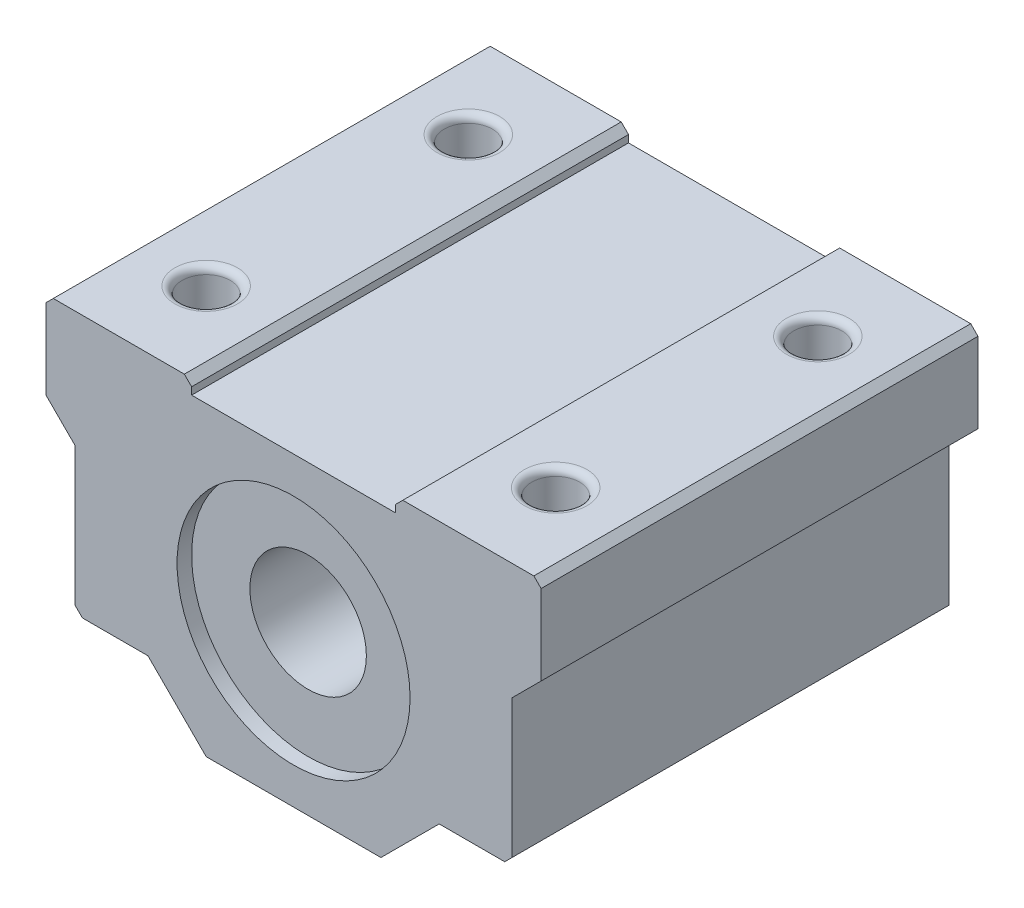
ISO-10303-21;
HEADER;
FILE_DESCRIPTION(('STEP AP214'),'2;1');
FILE_NAME('part.step','',(''),(''),'','','');
FILE_SCHEMA(('AUTOMOTIVE_DESIGN { 1 0 10303 214 1 1 1 1 }'));
ENDSEC;
DATA;
#1=APPLICATION_CONTEXT('core data for automotive mechanical design processes');
#2=APPLICATION_PROTOCOL_DEFINITION('international standard','automotive_design',2000,#1);
#3=PRODUCT_CONTEXT('',#1,'mechanical');
#4=PRODUCT('Part','Part','',(#3));
#5=PRODUCT_RELATED_PRODUCT_CATEGORY('part','',(#4));
#6=PRODUCT_DEFINITION_FORMATION('','',#4);
#7=PRODUCT_DEFINITION_CONTEXT('part definition',#1,'design');
#8=PRODUCT_DEFINITION('design','',#6,#7);
#9=PRODUCT_DEFINITION_SHAPE('','',#8);
#10=(LENGTH_UNIT() NAMED_UNIT(*) SI_UNIT(.MILLI.,.METRE.));
#11=(NAMED_UNIT(*) PLANE_ANGLE_UNIT() SI_UNIT($,.RADIAN.));
#12=(NAMED_UNIT(*) SI_UNIT($,.STERADIAN.) SOLID_ANGLE_UNIT());
#13=UNCERTAINTY_MEASURE_WITH_UNIT(LENGTH_MEASURE(1.E-05),#10,'distance_accuracy_value','');
#14=(GEOMETRIC_REPRESENTATION_CONTEXT(3) GLOBAL_UNCERTAINTY_ASSIGNED_CONTEXT((#13)) GLOBAL_UNIT_ASSIGNED_CONTEXT((#10,
#11,#12)) REPRESENTATION_CONTEXT('',''));
#15=CARTESIAN_POINT('',(0.,0.,0.));
#16=DIRECTION('',(0.,0.,1.));
#17=DIRECTION('',(1.,0.,0.));
#18=AXIS2_PLACEMENT_3D('',#15,#16,#17);
#19=CARTESIAN_POINT('',(0.,0.,15.));
#20=DIRECTION('',(0.,0.,-1.));
#21=DIRECTION('',(-1.,0.,0.));
#22=AXIS2_PLACEMENT_3D('',#19,#20,#21);
#23=CYLINDRICAL_SURFACE('',#22,8.);
#24=CARTESIAN_POINT('',(0.,0.,-15.));
#25=DIRECTION('',(0.,0.,1.));
#26=DIRECTION('',(1.,0.,0.));
#27=AXIS2_PLACEMENT_3D('',#24,#25,#26);
#28=CIRCLE('',#27,8.);
#29=CARTESIAN_POINT('',(8.,0.,-15.));
#30=VERTEX_POINT('',#29);
#31=EDGE_CURVE('E425',#30,#30,#28,.T.);
#32=ORIENTED_EDGE('',*,*,#31,.F.);
#33=EDGE_LOOP('',(#32));
#34=FACE_BOUND('',#33,.T.);
#35=CARTESIAN_POINT('',(0.,0.,-14.));
#36=DIRECTION('',(0.,0.,1.));
#37=DIRECTION('',(1.,0.,0.));
#38=AXIS2_PLACEMENT_3D('',#35,#36,#37);
#39=CIRCLE('',#38,8.);
#40=CARTESIAN_POINT('',(8.,0.,-14.));
#41=VERTEX_POINT('',#40);
#42=EDGE_CURVE('E764',#41,#41,#39,.T.);
#43=ORIENTED_EDGE('',*,*,#42,.T.);
#44=EDGE_LOOP('',(#43));
#45=FACE_BOUND('',#44,.T.);
#46=ADVANCED_FACE('F35',(#34,#45),#23,.F.);
#47=CARTESIAN_POINT('',(0.,0.,15.));
#48=DIRECTION('',(0.,0.,-1.));
#49=DIRECTION('',(-1.,0.,0.));
#50=AXIS2_PLACEMENT_3D('',#47,#48,#49);
#51=PLANE('',#50);
#52=DIRECTION('',(1.,0.,0.));
#53=VECTOR('',#52,1.);
#54=CARTESIAN_POINT('',(10.,-6.5,15.));
#55=LINE('',#54,#53);
#56=CARTESIAN_POINT('',(10.,-6.5,15.));
#57=VERTEX_POINT('',#56);
#58=CARTESIAN_POINT('',(14.5,-6.5,15.));
#59=VERTEX_POINT('',#58);
#60=EDGE_CURVE('E443',#57,#59,#55,.T.);
#61=ORIENTED_EDGE('',*,*,#60,.T.);
#62=DIRECTION('',(-0.707106781186548,-0.707106781186548,0.));
#63=VECTOR('',#62,1.);
#64=CARTESIAN_POINT('',(15.,-6.,15.));
#65=LINE('',#64,#63);
#66=CARTESIAN_POINT('',(15.,-6.,15.));
#67=VERTEX_POINT('',#66);
#68=EDGE_CURVE('E269',#59,#67,#65,.F.);
#69=ORIENTED_EDGE('',*,*,#68,.T.);
#70=DIRECTION('',(0.,1.,0.));
#71=VECTOR('',#70,1.);
#72=CARTESIAN_POINT('',(15.,-6.5,15.));
#73=LINE('',#72,#71);
#74=CARTESIAN_POINT('',(15.,3.5,15.));
#75=VERTEX_POINT('',#74);
#76=EDGE_CURVE('E445',#67,#75,#73,.T.);
#77=ORIENTED_EDGE('',*,*,#76,.T.);
#78=DIRECTION('',(0.707106781186547,0.707106781186547,0.));
#79=VECTOR('',#78,1.);
#80=CARTESIAN_POINT('',(15.,3.5,15.));
#81=LINE('',#80,#79);
#82=CARTESIAN_POINT('',(17.,5.5,15.));
#83=VERTEX_POINT('',#82);
#84=EDGE_CURVE('E447',#75,#83,#81,.T.);
#85=ORIENTED_EDGE('',*,*,#84,.T.);
#86=DIRECTION('',(0.,1.,0.));
#87=VECTOR('',#86,1.);
#88=CARTESIAN_POINT('',(17.,5.5,15.));
#89=LINE('',#88,#87);
#90=CARTESIAN_POINT('',(17.,11.,15.));
#91=VERTEX_POINT('',#90);
#92=EDGE_CURVE('E305',#83,#91,#89,.T.);
#93=ORIENTED_EDGE('',*,*,#92,.T.);
#94=DIRECTION('',(0.707106781186543,-0.707106781186552,0.));
#95=VECTOR('',#94,1.);
#96=CARTESIAN_POINT('',(16.5,11.5,15.));
#97=LINE('',#96,#95);
#98=CARTESIAN_POINT('',(16.5,11.5,15.));
#99=VERTEX_POINT('',#98);
#100=EDGE_CURVE('E261',#91,#99,#97,.F.);
#101=ORIENTED_EDGE('',*,*,#100,.T.);
#102=DIRECTION('',(-1.,0.,0.));
#103=VECTOR('',#102,1.);
#104=CARTESIAN_POINT('',(7.,11.5,15.));
#105=LINE('',#104,#103);
#106=CARTESIAN_POINT('',(7.5,11.5,15.));
#107=VERTEX_POINT('',#106);
#108=EDGE_CURVE('E295',#99,#107,#105,.T.);
#109=ORIENTED_EDGE('',*,*,#108,.T.);
#110=DIRECTION('',(0.707106781186548,0.707106781186548,0.));
#111=VECTOR('',#110,1.);
#112=CARTESIAN_POINT('',(7.,11.,15.));
#113=LINE('',#112,#111);
#114=CARTESIAN_POINT('',(7.,11.,15.));
#115=VERTEX_POINT('',#114);
#116=EDGE_CURVE('E263',#107,#115,#113,.F.);
#117=ORIENTED_EDGE('',*,*,#116,.T.);
#118=DIRECTION('',(0.,-1.,0.));
#119=VECTOR('',#118,1.);
#120=CARTESIAN_POINT('',(7.,10.5,15.));
#121=LINE('',#120,#119);
#122=CARTESIAN_POINT('',(7.,10.5,15.));
#123=VERTEX_POINT('',#122);
#124=EDGE_CURVE('E304',#115,#123,#121,.T.);
#125=ORIENTED_EDGE('',*,*,#124,.T.);
#126=DIRECTION('',(-1.,0.,0.));
#127=VECTOR('',#126,1.);
#128=CARTESIAN_POINT('',(-7.,10.5,15.));
#129=LINE('',#128,#127);
#130=CARTESIAN_POINT('',(-7.,10.5,15.));
#131=VERTEX_POINT('',#130);
#132=EDGE_CURVE('E451',#123,#131,#129,.T.);
#133=ORIENTED_EDGE('',*,*,#132,.T.);
#134=DIRECTION('',(0.,1.,0.));
#135=VECTOR('',#134,1.);
#136=CARTESIAN_POINT('',(-7.,10.5,15.));
#137=LINE('',#136,#135);
#138=CARTESIAN_POINT('',(-7.,11.,15.));
#139=VERTEX_POINT('',#138);
#140=EDGE_CURVE('E453',#131,#139,#137,.T.);
#141=ORIENTED_EDGE('',*,*,#140,.T.);
#142=DIRECTION('',(0.707106781186548,-0.707106781186548,0.));
#143=VECTOR('',#142,1.);
#144=CARTESIAN_POINT('',(-7.5,11.5,15.));
#145=LINE('',#144,#143);
#146=CARTESIAN_POINT('',(-7.5,11.5,15.));
#147=VERTEX_POINT('',#146);
#148=EDGE_CURVE('E57',#139,#147,#145,.F.);
#149=ORIENTED_EDGE('',*,*,#148,.T.);
#150=DIRECTION('',(-1.,0.,0.));
#151=VECTOR('',#150,1.);
#152=CARTESIAN_POINT('',(-17.,11.5,15.));
#153=LINE('',#152,#151);
#154=CARTESIAN_POINT('',(-16.5,11.5,15.));
#155=VERTEX_POINT('',#154);
#156=EDGE_CURVE('E336',#147,#155,#153,.T.);
#157=ORIENTED_EDGE('',*,*,#156,.T.);
#158=DIRECTION('',(0.707106781186548,0.707106781186548,0.));
#159=VECTOR('',#158,1.);
#160=CARTESIAN_POINT('',(-17.,11.,15.));
#161=LINE('',#160,#159);
#162=CARTESIAN_POINT('',(-17.,11.,15.));
#163=VERTEX_POINT('',#162);
#164=EDGE_CURVE('E192',#155,#163,#161,.F.);
#165=ORIENTED_EDGE('',*,*,#164,.T.);
#166=DIRECTION('',(0.,-1.,0.));
#167=VECTOR('',#166,1.);
#168=CARTESIAN_POINT('',(-17.,5.5,15.));
#169=LINE('',#168,#167);
#170=CARTESIAN_POINT('',(-17.,5.5,15.));
#171=VERTEX_POINT('',#170);
#172=EDGE_CURVE('E183',#163,#171,#169,.T.);
#173=ORIENTED_EDGE('',*,*,#172,.T.);
#174=DIRECTION('',(0.707106781186547,-0.707106781186547,0.));
#175=VECTOR('',#174,1.);
#176=CARTESIAN_POINT('',(-15.,3.5,15.));
#177=LINE('',#176,#175);
#178=CARTESIAN_POINT('',(-15.,3.5,15.));
#179=VERTEX_POINT('',#178);
#180=EDGE_CURVE('E189',#171,#179,#177,.T.);
#181=ORIENTED_EDGE('',*,*,#180,.T.);
#182=DIRECTION('',(0.,-1.,0.));
#183=VECTOR('',#182,1.);
#184=CARTESIAN_POINT('',(-15.,-6.5,15.));
#185=LINE('',#184,#183);
#186=CARTESIAN_POINT('',(-15.,-6.,15.));
#187=VERTEX_POINT('',#186);
#188=EDGE_CURVE('E206',#179,#187,#185,.T.);
#189=ORIENTED_EDGE('',*,*,#188,.T.);
#190=DIRECTION('',(-0.707106781186548,0.707106781186548,0.));
#191=VECTOR('',#190,1.);
#192=CARTESIAN_POINT('',(-14.5,-6.5,15.));
#193=LINE('',#192,#191);
#194=CARTESIAN_POINT('',(-14.5,-6.5,15.));
#195=VERTEX_POINT('',#194);
#196=EDGE_CURVE('E267',#187,#195,#193,.F.);
#197=ORIENTED_EDGE('',*,*,#196,.T.);
#198=DIRECTION('',(1.,0.,0.));
#199=VECTOR('',#198,1.);
#200=CARTESIAN_POINT('',(-10.,-6.5,15.));
#201=LINE('',#200,#199);
#202=CARTESIAN_POINT('',(-10.,-6.5,15.));
#203=VERTEX_POINT('',#202);
#204=EDGE_CURVE('E436',#195,#203,#201,.T.);
#205=ORIENTED_EDGE('',*,*,#204,.T.);
#206=DIRECTION('',(0.707106781186548,-0.707106781186548,0.));
#207=VECTOR('',#206,1.);
#208=CARTESIAN_POINT('',(-6.,-10.5,15.));
#209=LINE('',#208,#207);
#210=CARTESIAN_POINT('',(-6.,-10.5,15.));
#211=VERTEX_POINT('',#210);
#212=EDGE_CURVE('E360',#203,#211,#209,.T.);
#213=ORIENTED_EDGE('',*,*,#212,.T.);
#214=DIRECTION('',(1.,0.,0.));
#215=VECTOR('',#214,1.);
#216=CARTESIAN_POINT('',(-6.,-10.5,15.));
#217=LINE('',#216,#215);
#218=CARTESIAN_POINT('',(6.,-10.5,15.));
#219=VERTEX_POINT('',#218);
#220=EDGE_CURVE('E439',#211,#219,#217,.T.);
#221=ORIENTED_EDGE('',*,*,#220,.T.);
#222=DIRECTION('',(0.707106781186548,0.707106781186547,0.));
#223=VECTOR('',#222,1.);
#224=CARTESIAN_POINT('',(6.,-10.5,15.));
#225=LINE('',#224,#223);
#226=EDGE_CURVE('E441',#219,#57,#225,.T.);
#227=ORIENTED_EDGE('',*,*,#226,.T.);
#228=EDGE_LOOP('',(#61,#69,#77,#85,#93,#101,#109,#117,#125,#133,#141,#149,#157,#165,#173,#181,
#189,#197,#205,#213,#221,#227));
#229=FACE_BOUND('',#228,.T.);
#230=CARTESIAN_POINT('',(0.,0.,15.));
#231=DIRECTION('',(0.,0.,1.));
#232=DIRECTION('',(1.,0.,0.));
#233=AXIS2_PLACEMENT_3D('',#230,#231,#232);
#234=CIRCLE('',#233,8.);
#235=CARTESIAN_POINT('',(8.,0.,15.));
#236=VERTEX_POINT('',#235);
#237=EDGE_CURVE('E424',#236,#236,#234,.T.);
#238=ORIENTED_EDGE('',*,*,#237,.F.);
#239=EDGE_LOOP('',(#238));
#240=FACE_BOUND('',#239,.T.);
#241=ADVANCED_FACE('F186',(#229,#240),#51,.F.);
#242=CARTESIAN_POINT('',(0.,0.,-15.));
#243=DIRECTION('',(0.,0.,-1.));
#244=DIRECTION('',(-1.,0.,0.));
#245=AXIS2_PLACEMENT_3D('',#242,#243,#244);
#246=PLANE('',#245);
#247=DIRECTION('',(0.,1.,0.));
#248=VECTOR('',#247,1.);
#249=CARTESIAN_POINT('',(15.,-6.5,-15.));
#250=LINE('',#249,#248);
#251=CARTESIAN_POINT('',(15.,-6.,-15.));
#252=VERTEX_POINT('',#251);
#253=CARTESIAN_POINT('',(15.,3.5,-15.));
#254=VERTEX_POINT('',#253);
#255=EDGE_CURVE('E379',#252,#254,#250,.T.);
#256=ORIENTED_EDGE('',*,*,#255,.F.);
#257=DIRECTION('',(0.707106781186548,0.707106781186548,0.));
#258=VECTOR('',#257,1.);
#259=CARTESIAN_POINT('',(10.5,-10.5,-15.));
#260=LINE('',#259,#258);
#261=CARTESIAN_POINT('',(14.5,-6.5,-15.));
#262=VERTEX_POINT('',#261);
#263=EDGE_CURVE('E257',#252,#262,#260,.F.);
#264=ORIENTED_EDGE('',*,*,#263,.T.);
#265=DIRECTION('',(1.,0.,0.));
#266=VECTOR('',#265,1.);
#267=CARTESIAN_POINT('',(10.,-6.5,-15.));
#268=LINE('',#267,#266);
#269=CARTESIAN_POINT('',(10.,-6.5,-15.));
#270=VERTEX_POINT('',#269);
#271=EDGE_CURVE('E376',#270,#262,#268,.T.);
#272=ORIENTED_EDGE('',*,*,#271,.F.);
#273=DIRECTION('',(0.707106781186548,0.707106781186547,0.));
#274=VECTOR('',#273,1.);
#275=CARTESIAN_POINT('',(6.,-10.5,-15.));
#276=LINE('',#275,#274);
#277=CARTESIAN_POINT('',(6.,-10.5,-15.));
#278=VERTEX_POINT('',#277);
#279=EDGE_CURVE('E369',#278,#270,#276,.T.);
#280=ORIENTED_EDGE('',*,*,#279,.F.);
#281=DIRECTION('',(1.,0.,0.));
#282=VECTOR('',#281,1.);
#283=CARTESIAN_POINT('',(-6.,-10.5,-15.));
#284=LINE('',#283,#282);
#285=CARTESIAN_POINT('',(-6.,-10.5,-15.));
#286=VERTEX_POINT('',#285);
#287=EDGE_CURVE('E367',#286,#278,#284,.T.);
#288=ORIENTED_EDGE('',*,*,#287,.F.);
#289=DIRECTION('',(0.707106781186548,-0.707106781186548,0.));
#290=VECTOR('',#289,1.);
#291=CARTESIAN_POINT('',(-6.,-10.5,-15.));
#292=LINE('',#291,#290);
#293=CARTESIAN_POINT('',(-10.,-6.5,-15.));
#294=VERTEX_POINT('',#293);
#295=EDGE_CURVE('E359',#294,#286,#292,.T.);
#296=ORIENTED_EDGE('',*,*,#295,.F.);
#297=DIRECTION('',(1.,0.,0.));
#298=VECTOR('',#297,1.);
#299=CARTESIAN_POINT('',(-10.,-6.5,-15.));
#300=LINE('',#299,#298);
#301=CARTESIAN_POINT('',(-14.5,-6.5,-15.));
#302=VERTEX_POINT('',#301);
#303=EDGE_CURVE('E365',#302,#294,#300,.T.);
#304=ORIENTED_EDGE('',*,*,#303,.F.);
#305=DIRECTION('',(0.707106781186548,-0.707106781186548,0.));
#306=VECTOR('',#305,1.);
#307=CARTESIAN_POINT('',(-10.5,-10.5,-15.));
#308=LINE('',#307,#306);
#309=CARTESIAN_POINT('',(-15.,-6.,-15.));
#310=VERTEX_POINT('',#309);
#311=EDGE_CURVE('E255',#302,#310,#308,.F.);
#312=ORIENTED_EDGE('',*,*,#311,.T.);
#313=DIRECTION('',(0.,-1.,0.));
#314=VECTOR('',#313,1.);
#315=CARTESIAN_POINT('',(-15.,-6.5,-15.));
#316=LINE('',#315,#314);
#317=CARTESIAN_POINT('',(-15.,3.5,-15.));
#318=VERTEX_POINT('',#317);
#319=EDGE_CURVE('E371',#318,#310,#316,.T.);
#320=ORIENTED_EDGE('',*,*,#319,.F.);
#321=DIRECTION('',(0.707106781186547,-0.707106781186547,0.));
#322=VECTOR('',#321,1.);
#323=CARTESIAN_POINT('',(-15.,3.5,-15.));
#324=LINE('',#323,#322);
#325=CARTESIAN_POINT('',(-17.,5.5,-15.));
#326=VERTEX_POINT('',#325);
#327=EDGE_CURVE('E427',#326,#318,#324,.T.);
#328=ORIENTED_EDGE('',*,*,#327,.F.);
#329=DIRECTION('',(0.,-1.,0.));
#330=VECTOR('',#329,1.);
#331=CARTESIAN_POINT('',(-17.,5.5,-15.));
#332=LINE('',#331,#330);
#333=CARTESIAN_POINT('',(-17.,11.,-15.));
#334=VERTEX_POINT('',#333);
#335=EDGE_CURVE('E210',#334,#326,#332,.T.);
#336=ORIENTED_EDGE('',*,*,#335,.F.);
#337=DIRECTION('',(-0.707106781186548,-0.707106781186548,0.));
#338=VECTOR('',#337,1.);
#339=CARTESIAN_POINT('',(-14.,14.,-15.));
#340=LINE('',#339,#338);
#341=CARTESIAN_POINT('',(-16.5,11.5,-15.));
#342=VERTEX_POINT('',#341);
#343=EDGE_CURVE('E253',#334,#342,#340,.F.);
#344=ORIENTED_EDGE('',*,*,#343,.T.);
#345=DIRECTION('',(-1.,0.,0.));
#346=VECTOR('',#345,1.);
#347=CARTESIAN_POINT('',(-17.,11.5,-15.));
#348=LINE('',#347,#346);
#349=CARTESIAN_POINT('',(-7.5,11.5,-15.));
#350=VERTEX_POINT('',#349);
#351=EDGE_CURVE('E197',#350,#342,#348,.T.);
#352=ORIENTED_EDGE('',*,*,#351,.F.);
#353=DIRECTION('',(-0.707106781186548,0.707106781186548,0.));
#354=VECTOR('',#353,1.);
#355=CARTESIAN_POINT('',(2.,2.,-15.));
#356=LINE('',#355,#354);
#357=CARTESIAN_POINT('',(-7.,11.,-15.));
#358=VERTEX_POINT('',#357);
#359=EDGE_CURVE('E251',#350,#358,#356,.F.);
#360=ORIENTED_EDGE('',*,*,#359,.T.);
#361=DIRECTION('',(0.,1.,0.));
#362=VECTOR('',#361,1.);
#363=CARTESIAN_POINT('',(-7.,10.5,-15.));
#364=LINE('',#363,#362);
#365=CARTESIAN_POINT('',(-7.,10.5,-15.));
#366=VERTEX_POINT('',#365);
#367=EDGE_CURVE('E323',#366,#358,#364,.T.);
#368=ORIENTED_EDGE('',*,*,#367,.F.);
#369=DIRECTION('',(-1.,0.,0.));
#370=VECTOR('',#369,1.);
#371=CARTESIAN_POINT('',(-7.,10.5,-15.));
#372=LINE('',#371,#370);
#373=CARTESIAN_POINT('',(7.,10.5,-15.));
#374=VERTEX_POINT('',#373);
#375=EDGE_CURVE('E321',#374,#366,#372,.T.);
#376=ORIENTED_EDGE('',*,*,#375,.F.);
#377=DIRECTION('',(0.,-1.,0.));
#378=VECTOR('',#377,1.);
#379=CARTESIAN_POINT('',(7.,10.5,-15.));
#380=LINE('',#379,#378);
#381=CARTESIAN_POINT('',(7.,11.,-15.));
#382=VERTEX_POINT('',#381);
#383=EDGE_CURVE('E313',#382,#374,#380,.T.);
#384=ORIENTED_EDGE('',*,*,#383,.F.);
#385=DIRECTION('',(-0.707106781186548,-0.707106781186548,0.));
#386=VECTOR('',#385,1.);
#387=CARTESIAN_POINT('',(-2.,2.,-15.));
#388=LINE('',#387,#386);
#389=CARTESIAN_POINT('',(7.5,11.5,-15.));
#390=VERTEX_POINT('',#389);
#391=EDGE_CURVE('E249',#382,#390,#388,.F.);
#392=ORIENTED_EDGE('',*,*,#391,.T.);
#393=DIRECTION('',(-1.,0.,0.));
#394=VECTOR('',#393,1.);
#395=CARTESIAN_POINT('',(7.,11.5,-15.));
#396=LINE('',#395,#394);
#397=CARTESIAN_POINT('',(16.5,11.5,-15.));
#398=VERTEX_POINT('',#397);
#399=EDGE_CURVE('E298',#398,#390,#396,.T.);
#400=ORIENTED_EDGE('',*,*,#399,.F.);
#401=DIRECTION('',(-0.707106781186543,0.707106781186552,0.));
#402=VECTOR('',#401,1.);
#403=CARTESIAN_POINT('',(14.0000000000001,13.9999999999999,-15.));
#404=LINE('',#403,#402);
#405=CARTESIAN_POINT('',(17.,11.,-15.));
#406=VERTEX_POINT('',#405);
#407=EDGE_CURVE('E247',#398,#406,#404,.F.);
#408=ORIENTED_EDGE('',*,*,#407,.T.);
#409=DIRECTION('',(0.,1.,0.));
#410=VECTOR('',#409,1.);
#411=CARTESIAN_POINT('',(17.,5.5,-15.));
#412=LINE('',#411,#410);
#413=CARTESIAN_POINT('',(17.,5.5,-15.));
#414=VERTEX_POINT('',#413);
#415=EDGE_CURVE('E325',#414,#406,#412,.T.);
#416=ORIENTED_EDGE('',*,*,#415,.F.);
#417=DIRECTION('',(0.707106781186547,0.707106781186547,0.));
#418=VECTOR('',#417,1.);
#419=CARTESIAN_POINT('',(15.,3.5,-15.));
#420=LINE('',#419,#418);
#421=EDGE_CURVE('E381',#254,#414,#420,.T.);
#422=ORIENTED_EDGE('',*,*,#421,.F.);
#423=EDGE_LOOP('',(#256,#264,#272,#280,#288,#296,#304,#312,#320,#328,#336,#344,#352,#360,#368,
#376,#384,#392,#400,#408,#416,#422));
#424=FACE_BOUND('',#423,.T.);
#425=ORIENTED_EDGE('',*,*,#31,.T.);
#426=EDGE_LOOP('',(#425));
#427=FACE_BOUND('',#426,.T.);
#428=ADVANCED_FACE('F318',(#424,#427),#246,.T.);
#429=CARTESIAN_POINT('',(-17.,5.5,15.));
#430=DIRECTION('',(1.,0.,0.));
#431=DIRECTION('',(0.,0.,-1.));
#432=AXIS2_PLACEMENT_3D('',#429,#430,#431);
#433=PLANE('',#432);
#434=ORIENTED_EDGE('',*,*,#172,.F.);
#435=DIRECTION('',(0.,0.,-1.));
#436=VECTOR('',#435,1.);
#437=CARTESIAN_POINT('',(-17.,11.,15.));
#438=LINE('',#437,#436);
#439=EDGE_CURVE('E276',#163,#334,#438,.T.);
#440=ORIENTED_EDGE('',*,*,#439,.T.);
#441=ORIENTED_EDGE('',*,*,#335,.T.);
#442=DIRECTION('',(0.,0.,-1.));
#443=VECTOR('',#442,1.);
#444=CARTESIAN_POINT('',(-17.,5.5,15.));
#445=LINE('',#444,#443);
#446=EDGE_CURVE('E202',#171,#326,#445,.T.);
#447=ORIENTED_EDGE('',*,*,#446,.F.);
#448=EDGE_LOOP('',(#434,#440,#441,#447));
#449=FACE_BOUND('',#448,.T.);
#450=ADVANCED_FACE('F208',(#449),#433,.F.);
#451=CARTESIAN_POINT('',(-15.,3.5,15.));
#452=DIRECTION('',(0.707106781186547,0.707106781186547,0.));
#453=DIRECTION('',(-0.707106781186548,0.707106781186548,0.));
#454=AXIS2_PLACEMENT_3D('',#451,#452,#453);
#455=PLANE('',#454);
#456=ORIENTED_EDGE('',*,*,#327,.T.);
#457=DIRECTION('',(0.,0.,-1.));
#458=VECTOR('',#457,1.);
#459=CARTESIAN_POINT('',(-15.,3.5,15.));
#460=LINE('',#459,#458);
#461=EDGE_CURVE('E204',#179,#318,#460,.T.);
#462=ORIENTED_EDGE('',*,*,#461,.F.);
#463=ORIENTED_EDGE('',*,*,#180,.F.);
#464=ORIENTED_EDGE('',*,*,#446,.T.);
#465=EDGE_LOOP('',(#456,#462,#463,#464));
#466=FACE_BOUND('',#465,.T.);
#467=ADVANCED_FACE('F201',(#466),#455,.F.);
#468=CARTESIAN_POINT('',(-15.,-6.5,15.));
#469=DIRECTION('',(1.,0.,0.));
#470=DIRECTION('',(0.,0.,-1.));
#471=AXIS2_PLACEMENT_3D('',#468,#469,#470);
#472=PLANE('',#471);
#473=ORIENTED_EDGE('',*,*,#319,.T.);
#474=DIRECTION('',(0.,0.,1.));
#475=VECTOR('',#474,1.);
#476=CARTESIAN_POINT('',(-15.,-6.,15.));
#477=LINE('',#476,#475);
#478=EDGE_CURVE('E274',#310,#187,#477,.T.);
#479=ORIENTED_EDGE('',*,*,#478,.T.);
#480=ORIENTED_EDGE('',*,*,#188,.F.);
#481=ORIENTED_EDGE('',*,*,#461,.T.);
#482=EDGE_LOOP('',(#473,#479,#480,#481));
#483=FACE_BOUND('',#482,.T.);
#484=ADVANCED_FACE('F460',(#483),#472,.F.);
#485=CARTESIAN_POINT('',(-10.,-6.5,15.));
#486=DIRECTION('',(0.,1.,0.));
#487=DIRECTION('',(0.,0.,1.));
#488=AXIS2_PLACEMENT_3D('',#485,#486,#487);
#489=PLANE('',#488);
#490=CARTESIAN_POINT('',(-12.,-6.5,9.));
#491=DIRECTION('',(0.,1.,0.));
#492=DIRECTION('',(0.,0.,1.));
#493=AXIS2_PLACEMENT_3D('',#490,#491,#492);
#494=CIRCLE('',#493,1.65);
#495=CARTESIAN_POINT('',(-12.,-6.5,10.65));
#496=VERTEX_POINT('',#495);
#497=EDGE_CURVE('E762',#496,#496,#494,.T.);
#498=ORIENTED_EDGE('',*,*,#497,.T.);
#499=EDGE_LOOP('',(#498));
#500=FACE_BOUND('',#499,.T.);
#501=CARTESIAN_POINT('',(-12.,-6.5,-9.));
#502=DIRECTION('',(0.,1.,0.));
#503=DIRECTION('',(0.,0.,1.));
#504=AXIS2_PLACEMENT_3D('',#501,#502,#503);
#505=CIRCLE('',#504,1.65);
#506=CARTESIAN_POINT('',(-12.,-6.5,-7.35));
#507=VERTEX_POINT('',#506);
#508=EDGE_CURVE('E430',#507,#507,#505,.T.);
#509=ORIENTED_EDGE('',*,*,#508,.T.);
#510=EDGE_LOOP('',(#509));
#511=FACE_BOUND('',#510,.T.);
#512=ORIENTED_EDGE('',*,*,#204,.F.);
#513=DIRECTION('',(0.,0.,-1.));
#514=VECTOR('',#513,1.);
#515=CARTESIAN_POINT('',(-14.5,-6.5,15.));
#516=LINE('',#515,#514);
#517=EDGE_CURVE('E271',#195,#302,#516,.T.);
#518=ORIENTED_EDGE('',*,*,#517,.T.);
#519=ORIENTED_EDGE('',*,*,#303,.T.);
#520=DIRECTION('',(0.,0.,-1.));
#521=VECTOR('',#520,1.);
#522=CARTESIAN_POINT('',(-10.,-6.5,15.));
#523=LINE('',#522,#521);
#524=EDGE_CURVE('E217',#203,#294,#523,.T.);
#525=ORIENTED_EDGE('',*,*,#524,.F.);
#526=EDGE_LOOP('',(#512,#518,#519,#525));
#527=FACE_BOUND('',#526,.T.);
#528=ADVANCED_FACE('F465',(#500,#511,#527),#489,.F.);
#529=CARTESIAN_POINT('',(-6.,-10.5,15.));
#530=DIRECTION('',(0.707106781186548,0.707106781186548,0.));
#531=DIRECTION('',(-0.707106781186548,0.707106781186548,0.));
#532=AXIS2_PLACEMENT_3D('',#529,#530,#531);
#533=PLANE('',#532);
#534=ORIENTED_EDGE('',*,*,#295,.T.);
#535=DIRECTION('',(0.,0.,-1.));
#536=VECTOR('',#535,1.);
#537=CARTESIAN_POINT('',(-6.,-10.5,15.));
#538=LINE('',#537,#536);
#539=EDGE_CURVE('E350',#211,#286,#538,.T.);
#540=ORIENTED_EDGE('',*,*,#539,.F.);
#541=ORIENTED_EDGE('',*,*,#212,.F.);
#542=ORIENTED_EDGE('',*,*,#524,.T.);
#543=EDGE_LOOP('',(#534,#540,#541,#542));
#544=FACE_BOUND('',#543,.T.);
#545=ADVANCED_FACE('F357',(#544),#533,.F.);
#546=CARTESIAN_POINT('',(-6.,-10.5,15.));
#547=DIRECTION('',(0.,1.,0.));
#548=DIRECTION('',(0.,0.,1.));
#549=AXIS2_PLACEMENT_3D('',#546,#547,#548);
#550=PLANE('',#549);
#551=ORIENTED_EDGE('',*,*,#287,.T.);
#552=DIRECTION('',(0.,0.,-1.));
#553=VECTOR('',#552,1.);
#554=CARTESIAN_POINT('',(6.,-10.5,15.));
#555=LINE('',#554,#553);
#556=EDGE_CURVE('E347',#219,#278,#555,.T.);
#557=ORIENTED_EDGE('',*,*,#556,.F.);
#558=ORIENTED_EDGE('',*,*,#220,.F.);
#559=ORIENTED_EDGE('',*,*,#539,.T.);
#560=EDGE_LOOP('',(#551,#557,#558,#559));
#561=FACE_BOUND('',#560,.T.);
#562=ADVANCED_FACE('F473',(#561),#550,.F.);
#563=CARTESIAN_POINT('',(6.,-10.5,15.));
#564=DIRECTION('',(-0.707106781186547,0.707106781186548,0.));
#565=DIRECTION('',(-0.707106781186548,-0.707106781186547,0.));
#566=AXIS2_PLACEMENT_3D('',#563,#564,#565);
#567=PLANE('',#566);
#568=ORIENTED_EDGE('',*,*,#279,.T.);
#569=DIRECTION('',(0.,0.,-1.));
#570=VECTOR('',#569,1.);
#571=CARTESIAN_POINT('',(10.,-6.5,15.));
#572=LINE('',#571,#570);
#573=EDGE_CURVE('E344',#57,#270,#572,.T.);
#574=ORIENTED_EDGE('',*,*,#573,.F.);
#575=ORIENTED_EDGE('',*,*,#226,.F.);
#576=ORIENTED_EDGE('',*,*,#556,.T.);
#577=EDGE_LOOP('',(#568,#574,#575,#576));
#578=FACE_BOUND('',#577,.T.);
#579=ADVANCED_FACE('F549',(#578),#567,.F.);
#580=CARTESIAN_POINT('',(10.,-6.5,15.));
#581=DIRECTION('',(0.,1.,0.));
#582=DIRECTION('',(0.,0.,1.));
#583=AXIS2_PLACEMENT_3D('',#580,#581,#582);
#584=PLANE('',#583);
#585=CARTESIAN_POINT('',(12.,-6.5,9.));
#586=DIRECTION('',(0.,1.,0.));
#587=DIRECTION('',(0.,0.,1.));
#588=AXIS2_PLACEMENT_3D('',#585,#586,#587);
#589=CIRCLE('',#588,1.65);
#590=CARTESIAN_POINT('',(12.,-6.5,10.65));
#591=VERTEX_POINT('',#590);
#592=EDGE_CURVE('E767',#591,#591,#589,.T.);
#593=ORIENTED_EDGE('',*,*,#592,.T.);
#594=EDGE_LOOP('',(#593));
#595=FACE_BOUND('',#594,.T.);
#596=CARTESIAN_POINT('',(12.,-6.5,-9.));
#597=DIRECTION('',(0.,1.,0.));
#598=DIRECTION('',(0.,0.,1.));
#599=AXIS2_PLACEMENT_3D('',#596,#597,#598);
#600=CIRCLE('',#599,1.65);
#601=CARTESIAN_POINT('',(12.,-6.5,-7.35));
#602=VERTEX_POINT('',#601);
#603=EDGE_CURVE('E763',#602,#602,#600,.T.);
#604=ORIENTED_EDGE('',*,*,#603,.T.);
#605=EDGE_LOOP('',(#604));
#606=FACE_BOUND('',#605,.T.);
#607=ORIENTED_EDGE('',*,*,#271,.T.);
#608=DIRECTION('',(0.,0.,1.));
#609=VECTOR('',#608,1.);
#610=CARTESIAN_POINT('',(14.5,-6.5,15.));
#611=LINE('',#610,#609);
#612=EDGE_CURVE('E259',#262,#59,#611,.T.);
#613=ORIENTED_EDGE('',*,*,#612,.T.);
#614=ORIENTED_EDGE('',*,*,#60,.F.);
#615=ORIENTED_EDGE('',*,*,#573,.T.);
#616=EDGE_LOOP('',(#607,#613,#614,#615));
#617=FACE_BOUND('',#616,.T.);
#618=ADVANCED_FACE('F545',(#595,#606,#617),#584,.F.);
#619=CARTESIAN_POINT('',(15.,-6.5,15.));
#620=DIRECTION('',(-1.,0.,0.));
#621=DIRECTION('',(0.,0.,1.));
#622=AXIS2_PLACEMENT_3D('',#619,#620,#621);
#623=PLANE('',#622);
#624=ORIENTED_EDGE('',*,*,#76,.F.);
#625=DIRECTION('',(0.,0.,-1.));
#626=VECTOR('',#625,1.);
#627=CARTESIAN_POINT('',(15.,-6.,15.));
#628=LINE('',#627,#626);
#629=EDGE_CURVE('E244',#67,#252,#628,.T.);
#630=ORIENTED_EDGE('',*,*,#629,.T.);
#631=ORIENTED_EDGE('',*,*,#255,.T.);
#632=DIRECTION('',(0.,0.,-1.));
#633=VECTOR('',#632,1.);
#634=CARTESIAN_POINT('',(15.,3.5,15.));
#635=LINE('',#634,#633);
#636=EDGE_CURVE('E341',#75,#254,#635,.T.);
#637=ORIENTED_EDGE('',*,*,#636,.F.);
#638=EDGE_LOOP('',(#624,#630,#631,#637));
#639=FACE_BOUND('',#638,.T.);
#640=ADVANCED_FACE('F541',(#639),#623,.F.);
#641=CARTESIAN_POINT('',(15.,3.5,15.));
#642=DIRECTION('',(-0.707106781186547,0.707106781186547,0.));
#643=DIRECTION('',(-0.707106781186548,-0.707106781186548,0.));
#644=AXIS2_PLACEMENT_3D('',#641,#642,#643);
#645=PLANE('',#644);
#646=ORIENTED_EDGE('',*,*,#421,.T.);
#647=DIRECTION('',(0.,0.,-1.));
#648=VECTOR('',#647,1.);
#649=CARTESIAN_POINT('',(17.,5.5,15.));
#650=LINE('',#649,#648);
#651=EDGE_CURVE('E338',#83,#414,#650,.T.);
#652=ORIENTED_EDGE('',*,*,#651,.F.);
#653=ORIENTED_EDGE('',*,*,#84,.F.);
#654=ORIENTED_EDGE('',*,*,#636,.T.);
#655=EDGE_LOOP('',(#646,#652,#653,#654));
#656=FACE_BOUND('',#655,.T.);
#657=ADVANCED_FACE('F538',(#656),#645,.F.);
#658=CARTESIAN_POINT('',(17.,5.5,15.));
#659=DIRECTION('',(-1.,0.,0.));
#660=DIRECTION('',(0.,0.,1.));
#661=AXIS2_PLACEMENT_3D('',#658,#659,#660);
#662=PLANE('',#661);
#663=ORIENTED_EDGE('',*,*,#415,.T.);
#664=DIRECTION('',(0.,0.,1.));
#665=VECTOR('',#664,1.);
#666=CARTESIAN_POINT('',(17.,11.,15.));
#667=LINE('',#666,#665);
#668=EDGE_CURVE('E11',#406,#91,#667,.T.);
#669=ORIENTED_EDGE('',*,*,#668,.T.);
#670=ORIENTED_EDGE('',*,*,#92,.F.);
#671=ORIENTED_EDGE('',*,*,#651,.T.);
#672=EDGE_LOOP('',(#663,#669,#670,#671));
#673=FACE_BOUND('',#672,.T.);
#674=ADVANCED_FACE('F386',(#673),#662,.F.);
#675=CARTESIAN_POINT('',(7.,11.5,15.));
#676=DIRECTION('',(0.,-1.,0.));
#677=DIRECTION('',(0.,0.,-1.));
#678=AXIS2_PLACEMENT_3D('',#675,#676,#677);
#679=PLANE('',#678);
#680=CARTESIAN_POINT('',(12.,11.5,-9.));
#681=DIRECTION('',(0.,-1.,0.));
#682=DIRECTION('',(0.,0.,-1.));
#683=AXIS2_PLACEMENT_3D('',#680,#681,#682);
#684=CIRCLE('',#683,2.15);
#685=CARTESIAN_POINT('',(12.,11.5,-11.15));
#686=VERTEX_POINT('',#685);
#687=EDGE_CURVE('E226',#686,#686,#684,.T.);
#688=ORIENTED_EDGE('',*,*,#687,.T.);
#689=EDGE_LOOP('',(#688));
#690=FACE_BOUND('',#689,.T.);
#691=CARTESIAN_POINT('',(12.,11.5,9.));
#692=DIRECTION('',(0.,-1.,0.));
#693=DIRECTION('',(0.,0.,-1.));
#694=AXIS2_PLACEMENT_3D('',#691,#692,#693);
#695=CIRCLE('',#694,2.15);
#696=CARTESIAN_POINT('',(12.,11.5,6.85));
#697=VERTEX_POINT('',#696);
#698=EDGE_CURVE('E223',#697,#697,#695,.T.);
#699=ORIENTED_EDGE('',*,*,#698,.T.);
#700=EDGE_LOOP('',(#699));
#701=FACE_BOUND('',#700,.T.);
#702=ORIENTED_EDGE('',*,*,#399,.T.);
#703=DIRECTION('',(0.,0.,1.));
#704=VECTOR('',#703,1.);
#705=CARTESIAN_POINT('',(7.5,11.5,15.));
#706=LINE('',#705,#704);
#707=EDGE_CURVE('E43',#390,#107,#706,.T.);
#708=ORIENTED_EDGE('',*,*,#707,.T.);
#709=ORIENTED_EDGE('',*,*,#108,.F.);
#710=DIRECTION('',(0.,0.,-1.));
#711=VECTOR('',#710,1.);
#712=CARTESIAN_POINT('',(16.5,11.5,15.));
#713=LINE('',#712,#711);
#714=EDGE_CURVE('E287',#99,#398,#713,.T.);
#715=ORIENTED_EDGE('',*,*,#714,.T.);
#716=EDGE_LOOP('',(#702,#708,#709,#715));
#717=FACE_BOUND('',#716,.T.);
#718=ADVANCED_FACE('F294',(#690,#701,#717),#679,.F.);
#719=CARTESIAN_POINT('',(7.,10.5,15.));
#720=DIRECTION('',(1.,0.,0.));
#721=DIRECTION('',(0.,0.,-1.));
#722=AXIS2_PLACEMENT_3D('',#719,#720,#721);
#723=PLANE('',#722);
#724=ORIENTED_EDGE('',*,*,#124,.F.);
#725=DIRECTION('',(0.,0.,-1.));
#726=VECTOR('',#725,1.);
#727=CARTESIAN_POINT('',(7.,11.,15.));
#728=LINE('',#727,#726);
#729=EDGE_CURVE('E284',#115,#382,#728,.T.);
#730=ORIENTED_EDGE('',*,*,#729,.T.);
#731=ORIENTED_EDGE('',*,*,#383,.T.);
#732=DIRECTION('',(0.,0.,-1.));
#733=VECTOR('',#732,1.);
#734=CARTESIAN_POINT('',(7.,10.5,15.));
#735=LINE('',#734,#733);
#736=EDGE_CURVE('E335',#123,#374,#735,.T.);
#737=ORIENTED_EDGE('',*,*,#736,.F.);
#738=EDGE_LOOP('',(#724,#730,#731,#737));
#739=FACE_BOUND('',#738,.T.);
#740=ADVANCED_FACE('F311',(#739),#723,.F.);
#741=CARTESIAN_POINT('',(-7.,10.5,15.));
#742=DIRECTION('',(0.,-1.,0.));
#743=DIRECTION('',(0.,0.,-1.));
#744=AXIS2_PLACEMENT_3D('',#741,#742,#743);
#745=PLANE('',#744);
#746=ORIENTED_EDGE('',*,*,#375,.T.);
#747=DIRECTION('',(0.,0.,-1.));
#748=VECTOR('',#747,1.);
#749=CARTESIAN_POINT('',(-7.,10.5,15.));
#750=LINE('',#749,#748);
#751=EDGE_CURVE('E332',#131,#366,#750,.T.);
#752=ORIENTED_EDGE('',*,*,#751,.F.);
#753=ORIENTED_EDGE('',*,*,#132,.F.);
#754=ORIENTED_EDGE('',*,*,#736,.T.);
#755=EDGE_LOOP('',(#746,#752,#753,#754));
#756=FACE_BOUND('',#755,.T.);
#757=ADVANCED_FACE('F523',(#756),#745,.F.);
#758=CARTESIAN_POINT('',(-7.,10.5,15.));
#759=DIRECTION('',(-1.,0.,0.));
#760=DIRECTION('',(0.,0.,1.));
#761=AXIS2_PLACEMENT_3D('',#758,#759,#760);
#762=PLANE('',#761);
#763=ORIENTED_EDGE('',*,*,#367,.T.);
#764=DIRECTION('',(0.,0.,1.));
#765=VECTOR('',#764,1.);
#766=CARTESIAN_POINT('',(-7.,11.,15.));
#767=LINE('',#766,#765);
#768=EDGE_CURVE('E282',#358,#139,#767,.T.);
#769=ORIENTED_EDGE('',*,*,#768,.T.);
#770=ORIENTED_EDGE('',*,*,#140,.F.);
#771=ORIENTED_EDGE('',*,*,#751,.T.);
#772=EDGE_LOOP('',(#763,#769,#770,#771));
#773=FACE_BOUND('',#772,.T.);
#774=ADVANCED_FACE('F417',(#773),#762,.F.);
#775=CARTESIAN_POINT('',(-17.,11.5,15.));
#776=DIRECTION('',(0.,-1.,0.));
#777=DIRECTION('',(0.,0.,-1.));
#778=AXIS2_PLACEMENT_3D('',#775,#776,#777);
#779=PLANE('',#778);
#780=CARTESIAN_POINT('',(-12.,11.5,-9.));
#781=DIRECTION('',(0.,-1.,0.));
#782=DIRECTION('',(0.,0.,-1.));
#783=AXIS2_PLACEMENT_3D('',#780,#781,#782);
#784=CIRCLE('',#783,2.15);
#785=CARTESIAN_POINT('',(-12.,11.5,-11.15));
#786=VERTEX_POINT('',#785);
#787=EDGE_CURVE('E238',#786,#786,#784,.T.);
#788=ORIENTED_EDGE('',*,*,#787,.T.);
#789=EDGE_LOOP('',(#788));
#790=FACE_BOUND('',#789,.T.);
#791=CARTESIAN_POINT('',(-12.,11.5,9.));
#792=DIRECTION('',(0.,-1.,0.));
#793=DIRECTION('',(0.,0.,-1.));
#794=AXIS2_PLACEMENT_3D('',#791,#792,#793);
#795=CIRCLE('',#794,2.15);
#796=CARTESIAN_POINT('',(-12.,11.5,6.85));
#797=VERTEX_POINT('',#796);
#798=EDGE_CURVE('E235',#797,#797,#795,.T.);
#799=ORIENTED_EDGE('',*,*,#798,.T.);
#800=EDGE_LOOP('',(#799));
#801=FACE_BOUND('',#800,.T.);
#802=ORIENTED_EDGE('',*,*,#351,.T.);
#803=DIRECTION('',(0.,0.,1.));
#804=VECTOR('',#803,1.);
#805=CARTESIAN_POINT('',(-16.5,11.5,15.));
#806=LINE('',#805,#804);
#807=EDGE_CURVE('E50',#342,#155,#806,.T.);
#808=ORIENTED_EDGE('',*,*,#807,.T.);
#809=ORIENTED_EDGE('',*,*,#156,.F.);
#810=DIRECTION('',(0.,0.,-1.));
#811=VECTOR('',#810,1.);
#812=CARTESIAN_POINT('',(-7.5,11.5,15.));
#813=LINE('',#812,#811);
#814=EDGE_CURVE('E278',#147,#350,#813,.T.);
#815=ORIENTED_EDGE('',*,*,#814,.T.);
#816=EDGE_LOOP('',(#802,#808,#809,#815));
#817=FACE_BOUND('',#816,.T.);
#818=ADVANCED_FACE('F409',(#790,#801,#817),#779,.F.);
#819=CARTESIAN_POINT('',(0.,0.,14.));
#820=DIRECTION('',(0.,0.,1.));
#821=DIRECTION('',(1.,0.,0.));
#822=AXIS2_PLACEMENT_3D('',#819,#820,#821);
#823=CIRCLE('',#822,8.);
#824=CARTESIAN_POINT('',(8.,0.,14.));
#825=VERTEX_POINT('',#824);
#826=EDGE_CURVE('E212',#825,#825,#823,.T.);
#827=ORIENTED_EDGE('',*,*,#826,.F.);
#828=EDGE_LOOP('',(#827));
#829=FACE_BOUND('',#828,.T.);
#830=ORIENTED_EDGE('',*,*,#237,.T.);
#831=EDGE_LOOP('',(#830));
#832=FACE_BOUND('',#831,.T.);
#833=ADVANCED_FACE('F399',(#829,#832),#23,.F.);
#834=CARTESIAN_POINT('',(-12.,-10.5,-9.));
#835=DIRECTION('',(0.,1.,0.));
#836=DIRECTION('',(0.,0.,1.));
#837=AXIS2_PLACEMENT_3D('',#834,#835,#836);
#838=CYLINDRICAL_SURFACE('',#837,1.65);
#839=CARTESIAN_POINT('',(-12.,11.,-9.));
#840=DIRECTION('',(0.,-1.,0.));
#841=DIRECTION('',(0.,0.,-1.));
#842=AXIS2_PLACEMENT_3D('',#839,#840,#841);
#843=CIRCLE('',#842,1.65);
#844=CARTESIAN_POINT('',(-12.,11.,-10.65));
#845=VERTEX_POINT('',#844);
#846=EDGE_CURVE('E232',#845,#845,#843,.F.);
#847=ORIENTED_EDGE('',*,*,#846,.T.);
#848=EDGE_LOOP('',(#847));
#849=FACE_BOUND('',#848,.T.);
#850=ORIENTED_EDGE('',*,*,#508,.F.);
#851=EDGE_LOOP('',(#850));
#852=FACE_BOUND('',#851,.T.);
#853=ADVANCED_FACE('F408',(#849,#852),#838,.F.);
#854=CARTESIAN_POINT('',(-12.,-10.5,9.));
#855=DIRECTION('',(0.,1.,0.));
#856=DIRECTION('',(0.,0.,1.));
#857=AXIS2_PLACEMENT_3D('',#854,#855,#856);
#858=CYLINDRICAL_SURFACE('',#857,1.65);
#859=CARTESIAN_POINT('',(-12.,11.,9.));
#860=DIRECTION('',(0.,-1.,0.));
#861=DIRECTION('',(0.,0.,-1.));
#862=AXIS2_PLACEMENT_3D('',#859,#860,#861);
#863=CIRCLE('',#862,1.65);
#864=CARTESIAN_POINT('',(-12.,11.,7.35));
#865=VERTEX_POINT('',#864);
#866=EDGE_CURVE('E241',#865,#865,#863,.F.);
#867=ORIENTED_EDGE('',*,*,#866,.T.);
#868=EDGE_LOOP('',(#867));
#869=FACE_BOUND('',#868,.T.);
#870=ORIENTED_EDGE('',*,*,#497,.F.);
#871=EDGE_LOOP('',(#870));
#872=FACE_BOUND('',#871,.T.);
#873=ADVANCED_FACE('F415',(#869,#872),#858,.F.);
#874=CARTESIAN_POINT('',(12.,-10.5,-9.));
#875=DIRECTION('',(0.,1.,0.));
#876=DIRECTION('',(0.,0.,1.));
#877=AXIS2_PLACEMENT_3D('',#874,#875,#876);
#878=CYLINDRICAL_SURFACE('',#877,1.65);
#879=CARTESIAN_POINT('',(12.,11.,-9.));
#880=DIRECTION('',(0.,-1.,0.));
#881=DIRECTION('',(0.,0.,-1.));
#882=AXIS2_PLACEMENT_3D('',#879,#880,#881);
#883=CIRCLE('',#882,1.65);
#884=CARTESIAN_POINT('',(12.,11.,-10.65));
#885=VERTEX_POINT('',#884);
#886=EDGE_CURVE('E215',#885,#885,#883,.F.);
#887=ORIENTED_EDGE('',*,*,#886,.T.);
#888=EDGE_LOOP('',(#887));
#889=FACE_BOUND('',#888,.T.);
#890=ORIENTED_EDGE('',*,*,#603,.F.);
#891=EDGE_LOOP('',(#890));
#892=FACE_BOUND('',#891,.T.);
#893=ADVANCED_FACE('F695',(#889,#892),#878,.F.);
#894=CARTESIAN_POINT('',(12.,-10.5,9.));
#895=DIRECTION('',(0.,1.,0.));
#896=DIRECTION('',(0.,0.,1.));
#897=AXIS2_PLACEMENT_3D('',#894,#895,#896);
#898=CYLINDRICAL_SURFACE('',#897,1.65);
#899=CARTESIAN_POINT('',(12.,11.,9.));
#900=DIRECTION('',(0.,-1.,0.));
#901=DIRECTION('',(0.,0.,-1.));
#902=AXIS2_PLACEMENT_3D('',#899,#900,#901);
#903=CIRCLE('',#902,1.65);
#904=CARTESIAN_POINT('',(12.,11.,7.35));
#905=VERTEX_POINT('',#904);
#906=EDGE_CURVE('E229',#905,#905,#903,.F.);
#907=ORIENTED_EDGE('',*,*,#906,.T.);
#908=EDGE_LOOP('',(#907));
#909=FACE_BOUND('',#908,.T.);
#910=ORIENTED_EDGE('',*,*,#592,.F.);
#911=EDGE_LOOP('',(#910));
#912=FACE_BOUND('',#911,.T.);
#913=ADVANCED_FACE('F688',(#909,#912),#898,.F.);
#914=CARTESIAN_POINT('',(0.,0.,14.));
#915=DIRECTION('',(0.,0.,1.));
#916=DIRECTION('',(1.,0.,0.));
#917=AXIS2_PLACEMENT_3D('',#914,#915,#916);
#918=PLANE('',#917);
#919=ORIENTED_EDGE('',*,*,#826,.T.);
#920=EDGE_LOOP('',(#919));
#921=FACE_BOUND('',#920,.T.);
#922=CARTESIAN_POINT('',(0.,0.,14.));
#923=DIRECTION('',(0.,0.,1.));
#924=DIRECTION('',(1.,0.,0.));
#925=AXIS2_PLACEMENT_3D('',#922,#923,#924);
#926=CIRCLE('',#925,4.);
#927=CARTESIAN_POINT('',(4.,0.,14.));
#928=VERTEX_POINT('',#927);
#929=EDGE_CURVE('E770',#928,#928,#926,.T.);
#930=ORIENTED_EDGE('',*,*,#929,.F.);
#931=EDGE_LOOP('',(#930));
#932=FACE_BOUND('',#931,.T.);
#933=ADVANCED_FACE('F681',(#921,#932),#918,.T.);
#934=CARTESIAN_POINT('',(0.,0.,-14.));
#935=DIRECTION('',(0.,0.,1.));
#936=DIRECTION('',(1.,0.,0.));
#937=AXIS2_PLACEMENT_3D('',#934,#935,#936);
#938=PLANE('',#937);
#939=ORIENTED_EDGE('',*,*,#42,.F.);
#940=EDGE_LOOP('',(#939));
#941=FACE_BOUND('',#940,.T.);
#942=CARTESIAN_POINT('',(0.,0.,-14.));
#943=DIRECTION('',(0.,0.,1.));
#944=DIRECTION('',(1.,0.,0.));
#945=AXIS2_PLACEMENT_3D('',#942,#943,#944);
#946=CIRCLE('',#945,4.);
#947=CARTESIAN_POINT('',(4.,0.,-14.));
#948=VERTEX_POINT('',#947);
#949=EDGE_CURVE('E782',#948,#948,#946,.T.);
#950=ORIENTED_EDGE('',*,*,#949,.T.);
#951=EDGE_LOOP('',(#950));
#952=FACE_BOUND('',#951,.T.);
#953=ADVANCED_FACE('F672',(#941,#952),#938,.F.);
#954=CARTESIAN_POINT('',(0.,0.,14.));
#955=DIRECTION('',(0.,0.,-1.));
#956=DIRECTION('',(-1.,0.,0.));
#957=AXIS2_PLACEMENT_3D('',#954,#955,#956);
#958=CYLINDRICAL_SURFACE('',#957,4.);
#959=ORIENTED_EDGE('',*,*,#929,.T.);
#960=EDGE_LOOP('',(#959));
#961=FACE_BOUND('',#960,.T.);
#962=ORIENTED_EDGE('',*,*,#949,.F.);
#963=EDGE_LOOP('',(#962));
#964=FACE_BOUND('',#963,.T.);
#965=ADVANCED_FACE('F488',(#961,#964),#958,.F.);
#966=CARTESIAN_POINT('',(12.,11.,-9.));
#967=DIRECTION('',(0.,-1.,0.));
#968=DIRECTION('',(0.,0.,-1.));
#969=AXIS2_PLACEMENT_3D('',#966,#967,#968);
#970=TOROIDAL_SURFACE('',#969,2.15,0.5);
#971=ORIENTED_EDGE('',*,*,#687,.F.);
#972=EDGE_LOOP('',(#971));
#973=FACE_BOUND('',#972,.T.);
#974=ORIENTED_EDGE('',*,*,#886,.F.);
#975=EDGE_LOOP('',(#974));
#976=FACE_BOUND('',#975,.T.);
#977=ADVANCED_FACE('F484',(#973,#976),#970,.T.);
#978=CARTESIAN_POINT('',(12.,11.,9.));
#979=DIRECTION('',(0.,-1.,0.));
#980=DIRECTION('',(0.,0.,-1.));
#981=AXIS2_PLACEMENT_3D('',#978,#979,#980);
#982=TOROIDAL_SURFACE('',#981,2.15,0.5);
#983=ORIENTED_EDGE('',*,*,#698,.F.);
#984=EDGE_LOOP('',(#983));
#985=FACE_BOUND('',#984,.T.);
#986=ORIENTED_EDGE('',*,*,#906,.F.);
#987=EDGE_LOOP('',(#986));
#988=FACE_BOUND('',#987,.T.);
#989=ADVANCED_FACE('F487',(#985,#988),#982,.T.);
#990=CARTESIAN_POINT('',(-12.,11.,-9.));
#991=DIRECTION('',(0.,-1.,0.));
#992=DIRECTION('',(0.,0.,-1.));
#993=AXIS2_PLACEMENT_3D('',#990,#991,#992);
#994=TOROIDAL_SURFACE('',#993,2.15,0.5);
#995=ORIENTED_EDGE('',*,*,#787,.F.);
#996=EDGE_LOOP('',(#995));
#997=FACE_BOUND('',#996,.T.);
#998=ORIENTED_EDGE('',*,*,#846,.F.);
#999=EDGE_LOOP('',(#998));
#1000=FACE_BOUND('',#999,.T.);
#1001=ADVANCED_FACE('F492',(#997,#1000),#994,.T.);
#1002=CARTESIAN_POINT('',(-12.,11.,9.));
#1003=DIRECTION('',(0.,-1.,0.));
#1004=DIRECTION('',(0.,0.,-1.));
#1005=AXIS2_PLACEMENT_3D('',#1002,#1003,#1004);
#1006=TOROIDAL_SURFACE('',#1005,2.15,0.5);
#1007=ORIENTED_EDGE('',*,*,#798,.F.);
#1008=EDGE_LOOP('',(#1007));
#1009=FACE_BOUND('',#1008,.T.);
#1010=ORIENTED_EDGE('',*,*,#866,.F.);
#1011=EDGE_LOOP('',(#1010));
#1012=FACE_BOUND('',#1011,.T.);
#1013=ADVANCED_FACE('F496',(#1009,#1012),#1006,.T.);
#1014=CARTESIAN_POINT('',(15.,-6.,15.));
#1015=DIRECTION('',(-0.707106781186547,0.707106781186547,0.));
#1016=DIRECTION('',(0.,0.,-1.));
#1017=AXIS2_PLACEMENT_3D('',#1014,#1015,#1016);
#1018=PLANE('',#1017);
#1019=ORIENTED_EDGE('',*,*,#68,.F.);
#1020=ORIENTED_EDGE('',*,*,#612,.F.);
#1021=ORIENTED_EDGE('',*,*,#263,.F.);
#1022=ORIENTED_EDGE('',*,*,#629,.F.);
#1023=EDGE_LOOP('',(#1019,#1020,#1021,#1022));
#1024=FACE_BOUND('',#1023,.T.);
#1025=ADVANCED_FACE('F500',(#1024),#1018,.F.);
#1026=CARTESIAN_POINT('',(-14.5,-6.5,15.));
#1027=DIRECTION('',(0.707106781186547,0.707106781186547,0.));
#1028=DIRECTION('',(0.,0.,-1.));
#1029=AXIS2_PLACEMENT_3D('',#1026,#1027,#1028);
#1030=PLANE('',#1029);
#1031=ORIENTED_EDGE('',*,*,#196,.F.);
#1032=ORIENTED_EDGE('',*,*,#478,.F.);
#1033=ORIENTED_EDGE('',*,*,#311,.F.);
#1034=ORIENTED_EDGE('',*,*,#517,.F.);
#1035=EDGE_LOOP('',(#1031,#1032,#1033,#1034));
#1036=FACE_BOUND('',#1035,.T.);
#1037=ADVANCED_FACE('F463',(#1036),#1030,.F.);
#1038=CARTESIAN_POINT('',(-17.,11.,15.));
#1039=DIRECTION('',(0.707106781186547,-0.707106781186547,0.));
#1040=DIRECTION('',(0.,0.,-1.));
#1041=AXIS2_PLACEMENT_3D('',#1038,#1039,#1040);
#1042=PLANE('',#1041);
#1043=ORIENTED_EDGE('',*,*,#164,.F.);
#1044=ORIENTED_EDGE('',*,*,#807,.F.);
#1045=ORIENTED_EDGE('',*,*,#343,.F.);
#1046=ORIENTED_EDGE('',*,*,#439,.F.);
#1047=EDGE_LOOP('',(#1043,#1044,#1045,#1046));
#1048=FACE_BOUND('',#1047,.T.);
#1049=ADVANCED_FACE('F507',(#1048),#1042,.F.);
#1050=CARTESIAN_POINT('',(-7.5,11.5,15.));
#1051=DIRECTION('',(-0.707106781186547,-0.707106781186547,0.));
#1052=DIRECTION('',(0.,0.,-1.));
#1053=AXIS2_PLACEMENT_3D('',#1050,#1051,#1052);
#1054=PLANE('',#1053);
#1055=ORIENTED_EDGE('',*,*,#148,.F.);
#1056=ORIENTED_EDGE('',*,*,#768,.F.);
#1057=ORIENTED_EDGE('',*,*,#359,.F.);
#1058=ORIENTED_EDGE('',*,*,#814,.F.);
#1059=EDGE_LOOP('',(#1055,#1056,#1057,#1058));
#1060=FACE_BOUND('',#1059,.T.);
#1061=ADVANCED_FACE('F395',(#1060),#1054,.F.);
#1062=CARTESIAN_POINT('',(7.,11.,15.));
#1063=DIRECTION('',(0.707106781186547,-0.707106781186547,0.));
#1064=DIRECTION('',(0.,0.,-1.));
#1065=AXIS2_PLACEMENT_3D('',#1062,#1063,#1064);
#1066=PLANE('',#1065);
#1067=ORIENTED_EDGE('',*,*,#116,.F.);
#1068=ORIENTED_EDGE('',*,*,#707,.F.);
#1069=ORIENTED_EDGE('',*,*,#391,.F.);
#1070=ORIENTED_EDGE('',*,*,#729,.F.);
#1071=EDGE_LOOP('',(#1067,#1068,#1069,#1070));
#1072=FACE_BOUND('',#1071,.T.);
#1073=ADVANCED_FACE('F308',(#1072),#1066,.F.);
#1074=CARTESIAN_POINT('',(16.5,11.5,15.));
#1075=DIRECTION('',(-0.707106781186552,-0.707106781186543,0.));
#1076=DIRECTION('',(0.,0.,-1.));
#1077=AXIS2_PLACEMENT_3D('',#1074,#1075,#1076);
#1078=PLANE('',#1077);
#1079=ORIENTED_EDGE('',*,*,#100,.F.);
#1080=ORIENTED_EDGE('',*,*,#668,.F.);
#1081=ORIENTED_EDGE('',*,*,#407,.F.);
#1082=ORIENTED_EDGE('',*,*,#714,.F.);
#1083=EDGE_LOOP('',(#1079,#1080,#1081,#1082));
#1084=FACE_BOUND('',#1083,.T.);
#1085=ADVANCED_FACE('F37',(#1084),#1078,.F.);
#1086=CLOSED_SHELL('',(#46,#241,#428,#450,#467,#484,#528,#545,#562,#579,#618,#640,#657,#674,
#718,#740,#757,#774,#818,#833,#853,#873,#893,#913,#933,#953,#965,#977,#989,#1001,#1013,#1025,
#1037,#1049,#1061,#1073,#1085));
#1087=MANIFOLD_SOLID_BREP('B2',#1086);
#1088=ADVANCED_BREP_SHAPE_REPRESENTATION('',(#18,#1087),#14);
#1089=SHAPE_DEFINITION_REPRESENTATION(#9,#1088);
ENDSEC;
END-ISO-10303-21;
